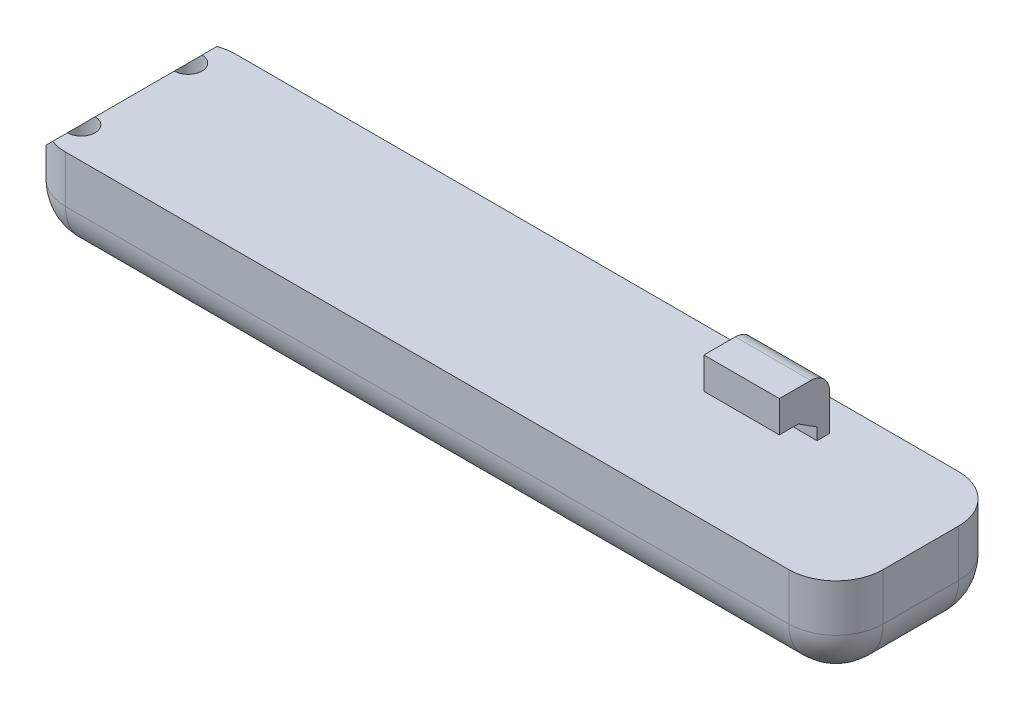
ISO-10303-21;
HEADER;
FILE_DESCRIPTION(('STEP AP214'),'2;1');
FILE_NAME('part.step','',(''),(''),'','','');
FILE_SCHEMA(('AUTOMOTIVE_DESIGN { 1 0 10303 214 1 1 1 1 }'));
ENDSEC;
DATA;
#1=APPLICATION_CONTEXT('core data for automotive mechanical design processes');
#2=APPLICATION_PROTOCOL_DEFINITION('international standard','automotive_design',2000,#1);
#3=PRODUCT_CONTEXT('',#1,'mechanical');
#4=PRODUCT('Part','Part','',(#3));
#5=PRODUCT_RELATED_PRODUCT_CATEGORY('part','',(#4));
#6=PRODUCT_DEFINITION_FORMATION('','',#4);
#7=PRODUCT_DEFINITION_CONTEXT('part definition',#1,'design');
#8=PRODUCT_DEFINITION('design','',#6,#7);
#9=PRODUCT_DEFINITION_SHAPE('','',#8);
#10=(LENGTH_UNIT() NAMED_UNIT(*) SI_UNIT(.MILLI.,.METRE.));
#11=(NAMED_UNIT(*) PLANE_ANGLE_UNIT() SI_UNIT($,.RADIAN.));
#12=(NAMED_UNIT(*) SI_UNIT($,.STERADIAN.) SOLID_ANGLE_UNIT());
#13=UNCERTAINTY_MEASURE_WITH_UNIT(LENGTH_MEASURE(1.E-05),#10,'distance_accuracy_value','');
#14=(GEOMETRIC_REPRESENTATION_CONTEXT(3) GLOBAL_UNCERTAINTY_ASSIGNED_CONTEXT((#13)) GLOBAL_UNIT_ASSIGNED_CONTEXT((#10,
#11,#12)) REPRESENTATION_CONTEXT('',''));
#15=CARTESIAN_POINT('',(0.,0.,0.));
#16=DIRECTION('',(0.,0.,1.));
#17=DIRECTION('',(1.,0.,0.));
#18=AXIS2_PLACEMENT_3D('',#15,#16,#17);
#19=CARTESIAN_POINT('',(0.,20.8,-19.));
#20=DIRECTION('',(1.,0.,0.));
#21=DIRECTION('',(0.,0.,-1.));
#22=AXIS2_PLACEMENT_3D('',#19,#20,#21);
#23=CYLINDRICAL_SURFACE('',#22,3.);
#24=DIRECTION('',(-1.,0.,0.));
#25=VECTOR('',#24,1.);
#26=CARTESIAN_POINT('',(0.,23.8,-19.));
#27=LINE('',#26,#25);
#28=CARTESIAN_POINT('',(107.,23.8,-19.));
#29=VERTEX_POINT('',#28);
#30=CARTESIAN_POINT('',(95.0000000000001,23.8,-19.));
#31=VERTEX_POINT('',#30);
#32=EDGE_CURVE('E386',#29,#31,#27,.T.);
#33=ORIENTED_EDGE('',*,*,#32,.F.);
#34=CARTESIAN_POINT('',(107.,20.8,-19.));
#35=DIRECTION('',(-1.,0.,0.));
#36=DIRECTION('',(0.,0.,1.));
#37=AXIS2_PLACEMENT_3D('',#34,#35,#36);
#38=CIRCLE('',#37,3.);
#39=CARTESIAN_POINT('',(107.,20.8,-22.));
#40=VERTEX_POINT('',#39);
#41=EDGE_CURVE('E55',#40,#29,#38,.F.);
#42=ORIENTED_EDGE('',*,*,#41,.F.);
#43=DIRECTION('',(-1.,0.,0.));
#44=VECTOR('',#43,1.);
#45=CARTESIAN_POINT('',(0.,20.8,-22.));
#46=LINE('',#45,#44);
#47=CARTESIAN_POINT('',(95.0000000000001,20.8,-22.));
#48=VERTEX_POINT('',#47);
#49=EDGE_CURVE('E390',#48,#40,#46,.F.);
#50=ORIENTED_EDGE('',*,*,#49,.F.);
#51=CARTESIAN_POINT('',(95.0000000000001,20.8,-19.));
#52=DIRECTION('',(1.,0.,0.));
#53=DIRECTION('',(0.,0.,-1.));
#54=AXIS2_PLACEMENT_3D('',#51,#52,#53);
#55=CIRCLE('',#54,3.);
#56=EDGE_CURVE('E11',#31,#48,#55,.F.);
#57=ORIENTED_EDGE('',*,*,#56,.F.);
#58=EDGE_LOOP('',(#33,#42,#50,#57));
#59=FACE_BOUND('',#58,.T.);
#60=ADVANCED_FACE('F47',(#59),#23,.T.);
#61=CARTESIAN_POINT('',(122.5,15.,-19.5));
#62=DIRECTION('',(0.,1.,0.));
#63=DIRECTION('',(0.,0.,1.));
#64=AXIS2_PLACEMENT_3D('',#61,#62,#63);
#65=PLANE('',#64);
#66=CARTESIAN_POINT('',(5.00000000000006,15.,-22.));
#67=DIRECTION('',(0.,1.,0.));
#68=DIRECTION('',(0.,0.,1.));
#69=AXIS2_PLACEMENT_3D('',#66,#67,#68);
#70=CIRCLE('',#69,2.2);
#71=CARTESIAN_POINT('',(5.00000000000009,15.,-19.8));
#72=VERTEX_POINT('',#71);
#73=CARTESIAN_POINT('',(5.0000000000001,15.,-24.2));
#74=VERTEX_POINT('',#73);
#75=EDGE_CURVE('E230',#72,#74,#70,.T.);
#76=ORIENTED_EDGE('',*,*,#75,.F.);
#77=DIRECTION('',(0.,0.,1.));
#78=VECTOR('',#77,1.);
#79=CARTESIAN_POINT('',(5.00000000000005,15.,-7.50000000000006));
#80=LINE('',#79,#78);
#81=CARTESIAN_POINT('',(5.00000000000005,15.,-7.2));
#82=VERTEX_POINT('',#81);
#83=EDGE_CURVE('E371',#72,#82,#80,.T.);
#84=ORIENTED_EDGE('',*,*,#83,.T.);
#85=CARTESIAN_POINT('',(5.00000000000006,15.,-5.));
#86=DIRECTION('',(0.,1.,0.));
#87=DIRECTION('',(0.,0.,1.));
#88=AXIS2_PLACEMENT_3D('',#85,#86,#87);
#89=CIRCLE('',#88,2.2);
#90=CARTESIAN_POINT('',(5.00000000000004,15.,-2.8));
#91=VERTEX_POINT('',#90);
#92=EDGE_CURVE('E233',#91,#82,#89,.T.);
#93=ORIENTED_EDGE('',*,*,#92,.F.);
#94=CARTESIAN_POINT('',(5.00000000000003,15.,-0.428932188134521));
#95=VERTEX_POINT('',#94);
#96=EDGE_CURVE('E365',#91,#95,#80,.T.);
#97=ORIENTED_EDGE('',*,*,#96,.T.);
#98=CARTESIAN_POINT('',(7.50000000000002,15.,-7.5));
#99=DIRECTION('',(0.,1.,0.));
#100=DIRECTION('',(0.,0.,-1.));
#101=AXIS2_PLACEMENT_3D('',#98,#99,#100);
#102=CIRCLE('',#101,7.5);
#103=CARTESIAN_POINT('',(7.50000000000007,15.,0.));
#104=VERTEX_POINT('',#103);
#105=EDGE_CURVE('E249',#95,#104,#102,.T.);
#106=ORIENTED_EDGE('',*,*,#105,.T.);
#107=DIRECTION('',(1.,0.,0.));
#108=VECTOR('',#107,1.);
#109=CARTESIAN_POINT('',(7.50000000000007,15.,0.));
#110=LINE('',#109,#108);
#111=CARTESIAN_POINT('',(122.5,15.,0.));
#112=VERTEX_POINT('',#111);
#113=EDGE_CURVE('E252',#104,#112,#110,.T.);
#114=ORIENTED_EDGE('',*,*,#113,.T.);
#115=CARTESIAN_POINT('',(122.5,15.,-7.5));
#116=DIRECTION('',(0.,1.,0.));
#117=DIRECTION('',(0.,0.,-1.));
#118=AXIS2_PLACEMENT_3D('',#115,#116,#117);
#119=CIRCLE('',#118,7.5);
#120=CARTESIAN_POINT('',(130.,15.,-7.5));
#121=VERTEX_POINT('',#120);
#122=EDGE_CURVE('E255',#112,#121,#119,.T.);
#123=ORIENTED_EDGE('',*,*,#122,.T.);
#124=DIRECTION('',(0.,0.,-1.));
#125=VECTOR('',#124,1.);
#126=CARTESIAN_POINT('',(130.,15.,-19.4999999999999));
#127=LINE('',#126,#125);
#128=CARTESIAN_POINT('',(130.,15.,-19.4999999999999));
#129=VERTEX_POINT('',#128);
#130=EDGE_CURVE('E258',#121,#129,#127,.T.);
#131=ORIENTED_EDGE('',*,*,#130,.T.);
#132=CARTESIAN_POINT('',(122.5,15.,-19.5));
#133=DIRECTION('',(0.,1.,0.));
#134=DIRECTION('',(0.,0.,1.));
#135=AXIS2_PLACEMENT_3D('',#132,#133,#134);
#136=CIRCLE('',#135,7.5);
#137=CARTESIAN_POINT('',(122.5,15.,-27.));
#138=VERTEX_POINT('',#137);
#139=EDGE_CURVE('E229',#129,#138,#136,.T.);
#140=ORIENTED_EDGE('',*,*,#139,.T.);
#141=DIRECTION('',(-1.,0.,0.));
#142=VECTOR('',#141,1.);
#143=CARTESIAN_POINT('',(7.50000000000011,15.,-27.));
#144=LINE('',#143,#142);
#145=CARTESIAN_POINT('',(7.50000000000006,15.,-27.));
#146=VERTEX_POINT('',#145);
#147=EDGE_CURVE('E242',#138,#146,#144,.T.);
#148=ORIENTED_EDGE('',*,*,#147,.T.);
#149=CARTESIAN_POINT('',(7.50000000000006,15.,-19.5));
#150=DIRECTION('',(0.,1.,0.));
#151=DIRECTION('',(0.,0.,-1.));
#152=AXIS2_PLACEMENT_3D('',#149,#150,#151);
#153=CIRCLE('',#152,7.5);
#154=CARTESIAN_POINT('',(5.00000000000011,15.,-26.5710678118655));
#155=VERTEX_POINT('',#154);
#156=EDGE_CURVE('E245',#146,#155,#153,.T.);
#157=ORIENTED_EDGE('',*,*,#156,.T.);
#158=EDGE_CURVE('E366',#155,#74,#80,.T.);
#159=ORIENTED_EDGE('',*,*,#158,.T.);
#160=EDGE_LOOP('',(#76,#84,#93,#97,#106,#114,#123,#131,#140,#148,#157,#159));
#161=FACE_BOUND('',#160,.T.);
#162=DIRECTION('',(1.,0.,0.));
#163=VECTOR('',#162,1.);
#164=CARTESIAN_POINT('',(95.0000000000001,15.,-20.));
#165=LINE('',#164,#163);
#166=CARTESIAN_POINT('',(95.0000000000001,15.,-20.));
#167=VERTEX_POINT('',#166);
#168=CARTESIAN_POINT('',(107.,15.,-20.));
#169=VERTEX_POINT('',#168);
#170=EDGE_CURVE('E211',#167,#169,#165,.T.);
#171=ORIENTED_EDGE('',*,*,#170,.F.);
#172=DIRECTION('',(0.,0.,1.));
#173=VECTOR('',#172,1.);
#174=CARTESIAN_POINT('',(95.0000000000001,15.,-22.));
#175=LINE('',#174,#173);
#176=CARTESIAN_POINT('',(95.0000000000001,15.,-22.));
#177=VERTEX_POINT('',#176);
#178=EDGE_CURVE('E425',#177,#167,#175,.T.);
#179=ORIENTED_EDGE('',*,*,#178,.F.);
#180=DIRECTION('',(-1.,0.,0.));
#181=VECTOR('',#180,1.);
#182=CARTESIAN_POINT('',(95.0000000000001,15.,-22.));
#183=LINE('',#182,#181);
#184=CARTESIAN_POINT('',(107.,15.,-22.));
#185=VERTEX_POINT('',#184);
#186=EDGE_CURVE('E434',#185,#177,#183,.T.);
#187=ORIENTED_EDGE('',*,*,#186,.F.);
#188=DIRECTION('',(0.,0.,-1.));
#189=VECTOR('',#188,1.);
#190=CARTESIAN_POINT('',(107.,15.,-22.));
#191=LINE('',#190,#189);
#192=EDGE_CURVE('E431',#169,#185,#191,.T.);
#193=ORIENTED_EDGE('',*,*,#192,.F.);
#194=EDGE_LOOP('',(#171,#179,#187,#193));
#195=FACE_BOUND('',#194,.T.);
#196=ADVANCED_FACE('F445',(#161,#195),#65,.T.);
#197=CARTESIAN_POINT('',(122.5,7.5,-7.5));
#198=DIRECTION('',(-1.,0.,0.));
#199=DIRECTION('',(0.,0.,1.));
#200=AXIS2_PLACEMENT_3D('',#197,#198,#199);
#201=CYLINDRICAL_SURFACE('',#200,7.5);
#202=CARTESIAN_POINT('',(7.50000000000007,7.5,-7.5));
#203=DIRECTION('',(-1.,0.,0.));
#204=DIRECTION('',(0.,0.,1.));
#205=AXIS2_PLACEMENT_3D('',#202,#203,#204);
#206=CIRCLE('',#205,7.5);
#207=CARTESIAN_POINT('',(7.50000000000007,0.,-7.5));
#208=VERTEX_POINT('',#207);
#209=CARTESIAN_POINT('',(7.50000000000007,7.5,0.));
#210=VERTEX_POINT('',#209);
#211=EDGE_CURVE('E362',#208,#210,#206,.T.);
#212=ORIENTED_EDGE('',*,*,#211,.F.);
#213=DIRECTION('',(-1.,0.,0.));
#214=VECTOR('',#213,1.);
#215=CARTESIAN_POINT('',(122.5,0.,-7.5));
#216=LINE('',#215,#214);
#217=CARTESIAN_POINT('',(122.5,0.,-7.5));
#218=VERTEX_POINT('',#217);
#219=EDGE_CURVE('E295',#218,#208,#216,.T.);
#220=ORIENTED_EDGE('',*,*,#219,.F.);
#221=CARTESIAN_POINT('',(122.5,7.5,-7.5));
#222=DIRECTION('',(-1.,0.,0.));
#223=DIRECTION('',(0.,0.,1.));
#224=AXIS2_PLACEMENT_3D('',#221,#222,#223);
#225=CIRCLE('',#224,7.5);
#226=CARTESIAN_POINT('',(122.5,7.5,0.));
#227=VERTEX_POINT('',#226);
#228=EDGE_CURVE('E359',#218,#227,#225,.T.);
#229=ORIENTED_EDGE('',*,*,#228,.T.);
#230=DIRECTION('',(-1.,0.,0.));
#231=VECTOR('',#230,1.);
#232=CARTESIAN_POINT('',(7.50000000000007,7.5,0.));
#233=LINE('',#232,#231);
#234=EDGE_CURVE('E335',#210,#227,#233,.F.);
#235=ORIENTED_EDGE('',*,*,#234,.F.);
#236=EDGE_LOOP('',(#212,#220,#229,#235));
#237=FACE_BOUND('',#236,.T.);
#238=ADVANCED_FACE('F447',(#237),#201,.T.);
#239=CARTESIAN_POINT('',(122.5,7.5,-7.5));
#240=DIRECTION('',(0.,1.,0.));
#241=DIRECTION('',(0.,0.,1.));
#242=AXIS2_PLACEMENT_3D('',#239,#240,#241);
#243=SPHERICAL_SURFACE('',#242,7.5);
#244=ORIENTED_EDGE('',*,*,#228,.F.);
#245=CARTESIAN_POINT('',(122.5,7.5,-7.50000000000005));
#246=DIRECTION('',(0.,0.,1.));
#247=DIRECTION('',(1.,0.,0.));
#248=AXIS2_PLACEMENT_3D('',#245,#246,#247);
#249=CIRCLE('',#248,7.5);
#250=CARTESIAN_POINT('',(130.,7.5,-7.5));
#251=VERTEX_POINT('',#250);
#252=EDGE_CURVE('E356',#218,#251,#249,.T.);
#253=ORIENTED_EDGE('',*,*,#252,.T.);
#254=CARTESIAN_POINT('',(122.5,7.5,-7.5));
#255=DIRECTION('',(0.,-1.,0.));
#256=DIRECTION('',(0.,0.,-1.));
#257=AXIS2_PLACEMENT_3D('',#254,#255,#256);
#258=CIRCLE('',#257,7.5);
#259=EDGE_CURVE('E331',#227,#251,#258,.F.);
#260=ORIENTED_EDGE('',*,*,#259,.F.);
#261=EDGE_LOOP('',(#244,#253,#260));
#262=FACE_BOUND('',#261,.T.);
#263=ADVANCED_FACE('F455',(#262),#243,.T.);
#264=CARTESIAN_POINT('',(122.5,7.5,-19.5));
#265=DIRECTION('',(0.,0.,1.));
#266=DIRECTION('',(1.,0.,0.));
#267=AXIS2_PLACEMENT_3D('',#264,#265,#266);
#268=CYLINDRICAL_SURFACE('',#267,7.5);
#269=ORIENTED_EDGE('',*,*,#252,.F.);
#270=DIRECTION('',(0.,0.,1.));
#271=VECTOR('',#270,1.);
#272=CARTESIAN_POINT('',(122.5,0.,-19.5));
#273=LINE('',#272,#271);
#274=CARTESIAN_POINT('',(122.5,0.,-19.5));
#275=VERTEX_POINT('',#274);
#276=EDGE_CURVE('E299',#275,#218,#273,.T.);
#277=ORIENTED_EDGE('',*,*,#276,.F.);
#278=CARTESIAN_POINT('',(122.5,7.5,-19.5));
#279=DIRECTION('',(0.,0.,1.));
#280=DIRECTION('',(1.,0.,0.));
#281=AXIS2_PLACEMENT_3D('',#278,#279,#280);
#282=CIRCLE('',#281,7.5);
#283=CARTESIAN_POINT('',(130.,7.5,-19.4999999999999));
#284=VERTEX_POINT('',#283);
#285=EDGE_CURVE('E353',#275,#284,#282,.T.);
#286=ORIENTED_EDGE('',*,*,#285,.T.);
#287=DIRECTION('',(0.,0.,1.));
#288=VECTOR('',#287,1.);
#289=CARTESIAN_POINT('',(130.,7.5,-19.4999999999999));
#290=LINE('',#289,#288);
#291=EDGE_CURVE('E327',#251,#284,#290,.F.);
#292=ORIENTED_EDGE('',*,*,#291,.F.);
#293=EDGE_LOOP('',(#269,#277,#286,#292));
#294=FACE_BOUND('',#293,.T.);
#295=ADVANCED_FACE('F520',(#294),#268,.T.);
#296=CARTESIAN_POINT('',(122.5,7.5,-19.5));
#297=DIRECTION('',(0.,1.,0.));
#298=DIRECTION('',(0.,0.,1.));
#299=AXIS2_PLACEMENT_3D('',#296,#297,#298);
#300=SPHERICAL_SURFACE('',#299,7.5);
#301=ORIENTED_EDGE('',*,*,#285,.F.);
#302=CARTESIAN_POINT('',(122.5,7.5,-19.5));
#303=DIRECTION('',(1.,0.,0.));
#304=DIRECTION('',(0.,0.,-1.));
#305=AXIS2_PLACEMENT_3D('',#302,#303,#304);
#306=CIRCLE('',#305,7.5);
#307=CARTESIAN_POINT('',(122.5,7.5,-27.));
#308=VERTEX_POINT('',#307);
#309=EDGE_CURVE('E350',#275,#308,#306,.T.);
#310=ORIENTED_EDGE('',*,*,#309,.T.);
#311=CARTESIAN_POINT('',(122.5,7.5,-19.5));
#312=DIRECTION('',(0.,-1.,0.));
#313=DIRECTION('',(0.,0.,-1.));
#314=AXIS2_PLACEMENT_3D('',#311,#312,#313);
#315=CIRCLE('',#314,7.5);
#316=EDGE_CURVE('E323',#284,#308,#315,.F.);
#317=ORIENTED_EDGE('',*,*,#316,.F.);
#318=EDGE_LOOP('',(#301,#310,#317));
#319=FACE_BOUND('',#318,.T.);
#320=ADVANCED_FACE('F516',(#319),#300,.T.);
#321=CARTESIAN_POINT('',(122.5,7.5,-19.5));
#322=DIRECTION('',(1.,0.,0.));
#323=DIRECTION('',(0.,0.,-1.));
#324=AXIS2_PLACEMENT_3D('',#321,#322,#323);
#325=CYLINDRICAL_SURFACE('',#324,7.5);
#326=ORIENTED_EDGE('',*,*,#309,.F.);
#327=DIRECTION('',(1.,0.,0.));
#328=VECTOR('',#327,1.);
#329=CARTESIAN_POINT('',(122.5,0.,-19.5));
#330=LINE('',#329,#328);
#331=CARTESIAN_POINT('',(7.50000000000006,0.,-19.5));
#332=VERTEX_POINT('',#331);
#333=EDGE_CURVE('E303',#332,#275,#330,.T.);
#334=ORIENTED_EDGE('',*,*,#333,.F.);
#335=CARTESIAN_POINT('',(7.50000000000006,7.5,-19.5));
#336=DIRECTION('',(1.,0.,0.));
#337=DIRECTION('',(0.,0.,-1.));
#338=AXIS2_PLACEMENT_3D('',#335,#336,#337);
#339=CIRCLE('',#338,7.5);
#340=CARTESIAN_POINT('',(7.50000000000006,7.5,-27.));
#341=VERTEX_POINT('',#340);
#342=EDGE_CURVE('E347',#332,#341,#339,.T.);
#343=ORIENTED_EDGE('',*,*,#342,.T.);
#344=DIRECTION('',(1.,0.,0.));
#345=VECTOR('',#344,1.);
#346=CARTESIAN_POINT('',(7.50000000000011,7.5,-27.));
#347=LINE('',#346,#345);
#348=EDGE_CURVE('E319',#308,#341,#347,.F.);
#349=ORIENTED_EDGE('',*,*,#348,.F.);
#350=EDGE_LOOP('',(#326,#334,#343,#349));
#351=FACE_BOUND('',#350,.T.);
#352=ADVANCED_FACE('F512',(#351),#325,.T.);
#353=CARTESIAN_POINT('',(7.50000000000006,7.5,-19.5));
#354=DIRECTION('',(0.,1.,0.));
#355=DIRECTION('',(0.,0.,1.));
#356=AXIS2_PLACEMENT_3D('',#353,#354,#355);
#357=SPHERICAL_SURFACE('',#356,7.5);
#358=ORIENTED_EDGE('',*,*,#342,.F.);
#359=CARTESIAN_POINT('',(7.50000000000006,7.5,-19.5));
#360=DIRECTION('',(0.,0.,-1.));
#361=DIRECTION('',(-1.,0.,0.));
#362=AXIS2_PLACEMENT_3D('',#359,#360,#361);
#363=CIRCLE('',#362,7.5);
#364=CARTESIAN_POINT('',(0.,7.5,-19.5));
#365=VERTEX_POINT('',#364);
#366=EDGE_CURVE('E343',#332,#365,#363,.T.);
#367=ORIENTED_EDGE('',*,*,#366,.T.);
#368=CARTESIAN_POINT('',(7.50000000000006,7.5,-19.5));
#369=DIRECTION('',(0.,-1.,0.));
#370=DIRECTION('',(0.,0.,-1.));
#371=AXIS2_PLACEMENT_3D('',#368,#369,#370);
#372=CIRCLE('',#371,7.5);
#373=EDGE_CURVE('E315',#341,#365,#372,.F.);
#374=ORIENTED_EDGE('',*,*,#373,.F.);
#375=EDGE_LOOP('',(#358,#367,#374));
#376=FACE_BOUND('',#375,.T.);
#377=ADVANCED_FACE('F508',(#376),#357,.T.);
#378=CARTESIAN_POINT('',(7.50000000000006,7.5,-19.5000000000004));
#379=DIRECTION('',(0.,0.,-1.));
#380=DIRECTION('',(-1.,0.,0.));
#381=AXIS2_PLACEMENT_3D('',#378,#379,#380);
#382=CYLINDRICAL_SURFACE('',#381,7.5);
#383=ORIENTED_EDGE('',*,*,#366,.F.);
#384=DIRECTION('',(0.,0.,-1.));
#385=VECTOR('',#384,1.);
#386=CARTESIAN_POINT('',(7.50000000000006,0.,-19.5000000000004));
#387=LINE('',#386,#385);
#388=EDGE_CURVE('E307',#208,#332,#387,.T.);
#389=ORIENTED_EDGE('',*,*,#388,.F.);
#390=CARTESIAN_POINT('',(7.50000000000002,7.5,-7.5));
#391=DIRECTION('',(0.,0.,-1.));
#392=DIRECTION('',(-1.,0.,0.));
#393=AXIS2_PLACEMENT_3D('',#390,#391,#392);
#394=CIRCLE('',#393,7.5);
#395=CARTESIAN_POINT('',(0.,7.5,-7.50000000000007));
#396=VERTEX_POINT('',#395);
#397=EDGE_CURVE('E339',#208,#396,#394,.T.);
#398=ORIENTED_EDGE('',*,*,#397,.T.);
#399=DIRECTION('',(0.,0.,-1.));
#400=VECTOR('',#399,1.);
#401=CARTESIAN_POINT('',(0.,7.5,-19.5));
#402=LINE('',#401,#400);
#403=EDGE_CURVE('E311',#365,#396,#402,.F.);
#404=ORIENTED_EDGE('',*,*,#403,.F.);
#405=EDGE_LOOP('',(#383,#389,#398,#404));
#406=FACE_BOUND('',#405,.T.);
#407=ADVANCED_FACE('F504',(#406),#382,.T.);
#408=CARTESIAN_POINT('',(7.50000000000002,7.5,-7.5));
#409=DIRECTION('',(0.,1.,0.));
#410=DIRECTION('',(0.,0.,1.));
#411=AXIS2_PLACEMENT_3D('',#408,#409,#410);
#412=SPHERICAL_SURFACE('',#411,7.5);
#413=ORIENTED_EDGE('',*,*,#397,.F.);
#414=ORIENTED_EDGE('',*,*,#211,.T.);
#415=CARTESIAN_POINT('',(7.50000000000002,7.5,-7.5));
#416=DIRECTION('',(0.,-1.,0.));
#417=DIRECTION('',(0.,0.,-1.));
#418=AXIS2_PLACEMENT_3D('',#415,#416,#417);
#419=CIRCLE('',#418,7.5);
#420=EDGE_CURVE('E291',#396,#210,#419,.F.);
#421=ORIENTED_EDGE('',*,*,#420,.F.);
#422=EDGE_LOOP('',(#413,#414,#421));
#423=FACE_BOUND('',#422,.T.);
#424=ADVANCED_FACE('F500',(#423),#412,.T.);
#425=CARTESIAN_POINT('',(122.5,15.,-19.5));
#426=DIRECTION('',(0.,-1.,0.));
#427=DIRECTION('',(0.,0.,-1.));
#428=AXIS2_PLACEMENT_3D('',#425,#426,#427);
#429=CYLINDRICAL_SURFACE('',#428,7.5);
#430=DIRECTION('',(0.,-1.,0.));
#431=VECTOR('',#430,1.);
#432=CARTESIAN_POINT('',(130.,15.,-19.4999999999999));
#433=LINE('',#432,#431);
#434=EDGE_CURVE('E261',#129,#284,#433,.T.);
#435=ORIENTED_EDGE('',*,*,#434,.T.);
#436=ORIENTED_EDGE('',*,*,#316,.T.);
#437=DIRECTION('',(0.,-1.,0.));
#438=VECTOR('',#437,1.);
#439=CARTESIAN_POINT('',(122.5,15.,-27.));
#440=LINE('',#439,#438);
#441=EDGE_CURVE('E287',#138,#308,#440,.T.);
#442=ORIENTED_EDGE('',*,*,#441,.F.);
#443=ORIENTED_EDGE('',*,*,#139,.F.);
#444=EDGE_LOOP('',(#435,#436,#442,#443));
#445=FACE_BOUND('',#444,.T.);
#446=ADVANCED_FACE('F496',(#445),#429,.T.);
#447=CARTESIAN_POINT('',(7.50000000000011,15.,-27.));
#448=DIRECTION('',(0.,0.,1.));
#449=DIRECTION('',(1.,0.,0.));
#450=AXIS2_PLACEMENT_3D('',#447,#448,#449);
#451=PLANE('',#450);
#452=ORIENTED_EDGE('',*,*,#441,.T.);
#453=ORIENTED_EDGE('',*,*,#348,.T.);
#454=DIRECTION('',(0.,-1.,0.));
#455=VECTOR('',#454,1.);
#456=CARTESIAN_POINT('',(7.50000000000006,15.,-27.));
#457=LINE('',#456,#455);
#458=EDGE_CURVE('E283',#146,#341,#457,.T.);
#459=ORIENTED_EDGE('',*,*,#458,.F.);
#460=ORIENTED_EDGE('',*,*,#147,.F.);
#461=EDGE_LOOP('',(#452,#453,#459,#460));
#462=FACE_BOUND('',#461,.T.);
#463=ADVANCED_FACE('F492',(#462),#451,.F.);
#464=CARTESIAN_POINT('',(7.50000000000006,15.,-19.5));
#465=DIRECTION('',(0.,-1.,0.));
#466=DIRECTION('',(0.,0.,-1.));
#467=AXIS2_PLACEMENT_3D('',#464,#465,#466);
#468=CYLINDRICAL_SURFACE('',#467,7.5);
#469=DIRECTION('',(0.,-1.,0.));
#470=VECTOR('',#469,1.);
#471=CARTESIAN_POINT('',(0.,15.,-19.5));
#472=LINE('',#471,#470);
#473=CARTESIAN_POINT('',(0.,9.99999999999998,-19.5));
#474=VERTEX_POINT('',#473);
#475=EDGE_CURVE('E280',#474,#365,#472,.T.);
#476=ORIENTED_EDGE('',*,*,#475,.F.);
#477=CARTESIAN_POINT('',(7.50000000000006,17.5,-19.5));
#478=DIRECTION('',(-0.707106781186547,0.707106781186548,0.));
#479=DIRECTION('',(-0.707106781186548,-0.707106781186547,0.));
#480=AXIS2_PLACEMENT_3D('',#477,#478,#479);
#481=ELLIPSE('',#480,10.6066017177982,7.5);
#482=EDGE_CURVE('E377',#474,#155,#481,.F.);
#483=ORIENTED_EDGE('',*,*,#482,.T.);
#484=ORIENTED_EDGE('',*,*,#156,.F.);
#485=ORIENTED_EDGE('',*,*,#458,.T.);
#486=ORIENTED_EDGE('',*,*,#373,.T.);
#487=EDGE_LOOP('',(#476,#483,#484,#485,#486));
#488=FACE_BOUND('',#487,.T.);
#489=ADVANCED_FACE('F488',(#488),#468,.T.);
#490=CARTESIAN_POINT('',(0.,15.,-19.5));
#491=DIRECTION('',(1.,0.,0.));
#492=DIRECTION('',(0.,0.,-1.));
#493=AXIS2_PLACEMENT_3D('',#490,#491,#492);
#494=PLANE('',#493);
#495=DIRECTION('',(0.,-1.,0.));
#496=VECTOR('',#495,1.);
#497=CARTESIAN_POINT('',(0.,15.,-7.50000000000007));
#498=LINE('',#497,#496);
#499=CARTESIAN_POINT('',(0.,9.99999999999998,-7.50000000000007));
#500=VERTEX_POINT('',#499);
#501=EDGE_CURVE('E277',#500,#396,#498,.T.);
#502=ORIENTED_EDGE('',*,*,#501,.F.);
#503=DIRECTION('',(0.,0.,-1.));
#504=VECTOR('',#503,1.);
#505=CARTESIAN_POINT('',(0.,9.99999999999998,-19.5));
#506=LINE('',#505,#504);
#507=EDGE_CURVE('E374',#500,#474,#506,.T.);
#508=ORIENTED_EDGE('',*,*,#507,.T.);
#509=ORIENTED_EDGE('',*,*,#475,.T.);
#510=ORIENTED_EDGE('',*,*,#403,.T.);
#511=EDGE_LOOP('',(#502,#508,#509,#510));
#512=FACE_BOUND('',#511,.T.);
#513=ADVANCED_FACE('F484',(#512),#494,.F.);
#514=CARTESIAN_POINT('',(7.50000000000002,15.,-7.5));
#515=DIRECTION('',(0.,-1.,0.));
#516=DIRECTION('',(0.,0.,-1.));
#517=AXIS2_PLACEMENT_3D('',#514,#515,#516);
#518=CYLINDRICAL_SURFACE('',#517,7.5);
#519=ORIENTED_EDGE('',*,*,#105,.F.);
#520=CARTESIAN_POINT('',(7.50000000000002,17.5,-7.5));
#521=DIRECTION('',(-0.707106781186547,0.707106781186548,0.));
#522=DIRECTION('',(-0.707106781186548,-0.707106781186547,0.));
#523=AXIS2_PLACEMENT_3D('',#520,#521,#522);
#524=ELLIPSE('',#523,10.6066017177982,7.5);
#525=EDGE_CURVE('E370',#95,#500,#524,.F.);
#526=ORIENTED_EDGE('',*,*,#525,.T.);
#527=ORIENTED_EDGE('',*,*,#501,.T.);
#528=ORIENTED_EDGE('',*,*,#420,.T.);
#529=DIRECTION('',(0.,-1.,0.));
#530=VECTOR('',#529,1.);
#531=CARTESIAN_POINT('',(7.50000000000007,15.,0.));
#532=LINE('',#531,#530);
#533=EDGE_CURVE('E273',#104,#210,#532,.T.);
#534=ORIENTED_EDGE('',*,*,#533,.F.);
#535=EDGE_LOOP('',(#519,#526,#527,#528,#534));
#536=FACE_BOUND('',#535,.T.);
#537=ADVANCED_FACE('F480',(#536),#518,.T.);
#538=CARTESIAN_POINT('',(7.50000000000007,15.,0.));
#539=DIRECTION('',(0.,0.,-1.));
#540=DIRECTION('',(-1.,0.,0.));
#541=AXIS2_PLACEMENT_3D('',#538,#539,#540);
#542=PLANE('',#541);
#543=ORIENTED_EDGE('',*,*,#533,.T.);
#544=ORIENTED_EDGE('',*,*,#234,.T.);
#545=DIRECTION('',(0.,-1.,0.));
#546=VECTOR('',#545,1.);
#547=CARTESIAN_POINT('',(122.5,15.,0.));
#548=LINE('',#547,#546);
#549=EDGE_CURVE('E269',#112,#227,#548,.T.);
#550=ORIENTED_EDGE('',*,*,#549,.F.);
#551=ORIENTED_EDGE('',*,*,#113,.F.);
#552=EDGE_LOOP('',(#543,#544,#550,#551));
#553=FACE_BOUND('',#552,.T.);
#554=ADVANCED_FACE('F476',(#553),#542,.F.);
#555=CARTESIAN_POINT('',(122.5,15.,-7.5));
#556=DIRECTION('',(0.,-1.,0.));
#557=DIRECTION('',(0.,0.,-1.));
#558=AXIS2_PLACEMENT_3D('',#555,#556,#557);
#559=CYLINDRICAL_SURFACE('',#558,7.5);
#560=ORIENTED_EDGE('',*,*,#549,.T.);
#561=ORIENTED_EDGE('',*,*,#259,.T.);
#562=DIRECTION('',(0.,-1.,0.));
#563=VECTOR('',#562,1.);
#564=CARTESIAN_POINT('',(130.,15.,-7.5));
#565=LINE('',#564,#563);
#566=EDGE_CURVE('E265',#121,#251,#565,.T.);
#567=ORIENTED_EDGE('',*,*,#566,.F.);
#568=ORIENTED_EDGE('',*,*,#122,.F.);
#569=EDGE_LOOP('',(#560,#561,#567,#568));
#570=FACE_BOUND('',#569,.T.);
#571=ADVANCED_FACE('F472',(#570),#559,.T.);
#572=CARTESIAN_POINT('',(130.,15.,-19.4999999999999));
#573=DIRECTION('',(-1.,0.,0.));
#574=DIRECTION('',(0.,0.,1.));
#575=AXIS2_PLACEMENT_3D('',#572,#573,#574);
#576=PLANE('',#575);
#577=ORIENTED_EDGE('',*,*,#566,.T.);
#578=ORIENTED_EDGE('',*,*,#291,.T.);
#579=ORIENTED_EDGE('',*,*,#434,.F.);
#580=ORIENTED_EDGE('',*,*,#130,.F.);
#581=EDGE_LOOP('',(#577,#578,#579,#580));
#582=FACE_BOUND('',#581,.T.);
#583=ADVANCED_FACE('F468',(#582),#576,.F.);
#584=CARTESIAN_POINT('',(122.5,0.,-19.5));
#585=DIRECTION('',(0.,1.,0.));
#586=DIRECTION('',(0.,0.,1.));
#587=AXIS2_PLACEMENT_3D('',#584,#585,#586);
#588=PLANE('',#587);
#589=ORIENTED_EDGE('',*,*,#219,.T.);
#590=ORIENTED_EDGE('',*,*,#388,.T.);
#591=ORIENTED_EDGE('',*,*,#333,.T.);
#592=ORIENTED_EDGE('',*,*,#276,.T.);
#593=EDGE_LOOP('',(#589,#590,#591,#592));
#594=FACE_BOUND('',#593,.T.);
#595=ADVANCED_FACE('F464',(#594),#588,.F.);
#596=CARTESIAN_POINT('',(5.00000000000009,15.,-19.5000000000004));
#597=DIRECTION('',(-0.707106781186547,0.707106781186548,0.));
#598=DIRECTION('',(0.,0.,-1.));
#599=AXIS2_PLACEMENT_3D('',#596,#597,#598);
#600=PLANE('',#599);
#601=CARTESIAN_POINT('',(5.00000000000006,15.,-22.));
#602=DIRECTION('',(-0.707106781186547,0.707106781186548,0.));
#603=DIRECTION('',(0.707106781186548,0.707106781186547,0.));
#604=AXIS2_PLACEMENT_3D('',#601,#602,#603);
#605=ELLIPSE('',#604,3.11126983722081,2.2);
#606=EDGE_CURVE('E383',#74,#72,#605,.T.);
#607=ORIENTED_EDGE('',*,*,#606,.F.);
#608=ORIENTED_EDGE('',*,*,#158,.F.);
#609=ORIENTED_EDGE('',*,*,#482,.F.);
#610=ORIENTED_EDGE('',*,*,#507,.F.);
#611=ORIENTED_EDGE('',*,*,#525,.F.);
#612=ORIENTED_EDGE('',*,*,#96,.F.);
#613=CARTESIAN_POINT('',(5.00000000000006,15.,-5.));
#614=DIRECTION('',(-0.707106781186547,0.707106781186548,0.));
#615=DIRECTION('',(0.707106781186548,0.707106781186547,0.));
#616=AXIS2_PLACEMENT_3D('',#613,#614,#615);
#617=ELLIPSE('',#616,3.11126983722081,2.2);
#618=EDGE_CURVE('E380',#82,#91,#617,.T.);
#619=ORIENTED_EDGE('',*,*,#618,.F.);
#620=ORIENTED_EDGE('',*,*,#83,.F.);
#621=EDGE_LOOP('',(#607,#608,#609,#610,#611,#612,#619,#620));
#622=FACE_BOUND('',#621,.T.);
#623=ADVANCED_FACE('F467',(#622),#600,.T.);
#624=CARTESIAN_POINT('',(5.00000000000006,5.,-5.));
#625=DIRECTION('',(0.,1.,0.));
#626=DIRECTION('',(0.,0.,1.));
#627=AXIS2_PLACEMENT_3D('',#624,#625,#626);
#628=CYLINDRICAL_SURFACE('',#627,2.2);
#629=ORIENTED_EDGE('',*,*,#618,.T.);
#630=ORIENTED_EDGE('',*,*,#92,.T.);
#631=EDGE_LOOP('',(#629,#630));
#632=FACE_BOUND('',#631,.T.);
#633=CARTESIAN_POINT('',(5.00000000000006,5.,-5.));
#634=DIRECTION('',(0.,1.,0.));
#635=DIRECTION('',(0.,0.,1.));
#636=AXIS2_PLACEMENT_3D('',#633,#634,#635);
#637=CIRCLE('',#636,2.2);
#638=CARTESIAN_POINT('',(5.00000000000006,5.,-2.8));
#639=VERTEX_POINT('',#638);
#640=EDGE_CURVE('E219',#639,#639,#637,.T.);
#641=ORIENTED_EDGE('',*,*,#640,.F.);
#642=EDGE_LOOP('',(#641));
#643=FACE_BOUND('',#642,.T.);
#644=ADVANCED_FACE('F531',(#632,#643),#628,.F.);
#645=CARTESIAN_POINT('',(5.00000000000006,5.,-5.));
#646=DIRECTION('',(0.,1.,0.));
#647=DIRECTION('',(0.,0.,1.));
#648=AXIS2_PLACEMENT_3D('',#645,#646,#647);
#649=PLANE('',#648);
#650=ORIENTED_EDGE('',*,*,#640,.T.);
#651=EDGE_LOOP('',(#650));
#652=FACE_BOUND('',#651,.T.);
#653=ADVANCED_FACE('F462',(#652),#649,.T.);
#654=CARTESIAN_POINT('',(5.00000000000006,5.,-22.));
#655=DIRECTION('',(0.,1.,0.));
#656=DIRECTION('',(0.,0.,1.));
#657=AXIS2_PLACEMENT_3D('',#654,#655,#656);
#658=CYLINDRICAL_SURFACE('',#657,2.2);
#659=ORIENTED_EDGE('',*,*,#606,.T.);
#660=ORIENTED_EDGE('',*,*,#75,.T.);
#661=EDGE_LOOP('',(#659,#660));
#662=FACE_BOUND('',#661,.T.);
#663=CARTESIAN_POINT('',(5.00000000000006,5.,-22.));
#664=DIRECTION('',(0.,1.,0.));
#665=DIRECTION('',(0.,0.,1.));
#666=AXIS2_PLACEMENT_3D('',#663,#664,#665);
#667=CIRCLE('',#666,2.2);
#668=CARTESIAN_POINT('',(5.00000000000006,5.,-19.8));
#669=VERTEX_POINT('',#668);
#670=EDGE_CURVE('E225',#669,#669,#667,.T.);
#671=ORIENTED_EDGE('',*,*,#670,.F.);
#672=EDGE_LOOP('',(#671));
#673=FACE_BOUND('',#672,.T.);
#674=ADVANCED_FACE('F576',(#662,#673),#658,.F.);
#675=CARTESIAN_POINT('',(5.00000000000006,5.,-22.));
#676=DIRECTION('',(0.,1.,0.));
#677=DIRECTION('',(0.,0.,1.));
#678=AXIS2_PLACEMENT_3D('',#675,#676,#677);
#679=PLANE('',#678);
#680=ORIENTED_EDGE('',*,*,#670,.T.);
#681=EDGE_LOOP('',(#680));
#682=FACE_BOUND('',#681,.T.);
#683=ADVANCED_FACE('F580',(#682),#679,.T.);
#684=CARTESIAN_POINT('',(95.0000000000001,18.8,-22.));
#685=DIRECTION('',(1.,0.,0.));
#686=DIRECTION('',(0.,0.,-1.));
#687=AXIS2_PLACEMENT_3D('',#684,#685,#686);
#688=PLANE('',#687);
#689=DIRECTION('',(0.,-1.,0.));
#690=VECTOR('',#689,1.);
#691=CARTESIAN_POINT('',(95.0000000000001,18.8,-20.));
#692=LINE('',#691,#690);
#693=CARTESIAN_POINT('',(95.0000000000001,16.9,-20.));
#694=VERTEX_POINT('',#693);
#695=EDGE_CURVE('E214',#694,#167,#692,.T.);
#696=ORIENTED_EDGE('',*,*,#695,.F.);
#697=DIRECTION('',(0.,0.535052081184345,0.844819075554228));
#698=VECTOR('',#697,1.);
#699=CARTESIAN_POINT('',(95.0000000000001,16.9,-20.));
#700=LINE('',#699,#698);
#701=CARTESIAN_POINT('',(95.0000000000001,18.8,-17.));
#702=VERTEX_POINT('',#701);
#703=EDGE_CURVE('E62',#694,#702,#700,.T.);
#704=ORIENTED_EDGE('',*,*,#703,.T.);
#705=DIRECTION('',(0.,0.,1.));
#706=VECTOR('',#705,1.);
#707=CARTESIAN_POINT('',(95.0000000000001,18.8,-22.));
#708=LINE('',#707,#706);
#709=CARTESIAN_POINT('',(95.0000000000001,18.8,-14.));
#710=VERTEX_POINT('',#709);
#711=EDGE_CURVE('E414',#702,#710,#708,.T.);
#712=ORIENTED_EDGE('',*,*,#711,.T.);
#713=DIRECTION('',(0.,-1.,0.));
#714=VECTOR('',#713,1.);
#715=CARTESIAN_POINT('',(95.0000000000001,23.8,-14.));
#716=LINE('',#715,#714);
#717=CARTESIAN_POINT('',(95.0000000000001,23.8,-14.));
#718=VERTEX_POINT('',#717);
#719=EDGE_CURVE('E408',#718,#710,#716,.T.);
#720=ORIENTED_EDGE('',*,*,#719,.F.);
#721=DIRECTION('',(0.,0.,1.));
#722=VECTOR('',#721,1.);
#723=CARTESIAN_POINT('',(95.0000000000001,23.8,-22.));
#724=LINE('',#723,#722);
#725=EDGE_CURVE('E410',#31,#718,#724,.T.);
#726=ORIENTED_EDGE('',*,*,#725,.F.);
#727=ORIENTED_EDGE('',*,*,#56,.T.);
#728=DIRECTION('',(0.,-1.,0.));
#729=VECTOR('',#728,1.);
#730=CARTESIAN_POINT('',(95.0000000000001,18.8,-22.));
#731=LINE('',#730,#729);
#732=EDGE_CURVE('E221',#48,#177,#731,.T.);
#733=ORIENTED_EDGE('',*,*,#732,.T.);
#734=ORIENTED_EDGE('',*,*,#178,.T.);
#735=EDGE_LOOP('',(#696,#704,#712,#720,#726,#727,#733,#734));
#736=FACE_BOUND('',#735,.T.);
#737=ADVANCED_FACE('F439',(#736),#688,.F.);
#738=CARTESIAN_POINT('',(95.0000000000001,18.8,-20.));
#739=DIRECTION('',(0.,0.,-1.));
#740=DIRECTION('',(-1.,0.,0.));
#741=AXIS2_PLACEMENT_3D('',#738,#739,#740);
#742=PLANE('',#741);
#743=DIRECTION('',(0.,-1.,0.));
#744=VECTOR('',#743,1.);
#745=CARTESIAN_POINT('',(107.,18.8,-20.));
#746=LINE('',#745,#744);
#747=CARTESIAN_POINT('',(107.,16.9,-20.));
#748=VERTEX_POINT('',#747);
#749=EDGE_CURVE('E202',#748,#169,#746,.T.);
#750=ORIENTED_EDGE('',*,*,#749,.F.);
#751=DIRECTION('',(-1.,0.,0.));
#752=VECTOR('',#751,1.);
#753=CARTESIAN_POINT('',(107.,16.9,-20.));
#754=LINE('',#753,#752);
#755=EDGE_CURVE('E188',#748,#694,#754,.T.);
#756=ORIENTED_EDGE('',*,*,#755,.T.);
#757=ORIENTED_EDGE('',*,*,#695,.T.);
#758=ORIENTED_EDGE('',*,*,#170,.T.);
#759=EDGE_LOOP('',(#750,#756,#757,#758));
#760=FACE_BOUND('',#759,.T.);
#761=ADVANCED_FACE('F209',(#760),#742,.F.);
#762=CARTESIAN_POINT('',(107.,18.8,-22.));
#763=DIRECTION('',(-1.,0.,0.));
#764=DIRECTION('',(0.,0.,1.));
#765=AXIS2_PLACEMENT_3D('',#762,#763,#764);
#766=PLANE('',#765);
#767=DIRECTION('',(0.,0.535052081184345,0.844819075554228));
#768=VECTOR('',#767,1.);
#769=CARTESIAN_POINT('',(107.,16.9,-20.));
#770=LINE('',#769,#768);
#771=CARTESIAN_POINT('',(107.,18.8,-17.));
#772=VERTEX_POINT('',#771);
#773=EDGE_CURVE('E191',#748,#772,#770,.T.);
#774=ORIENTED_EDGE('',*,*,#773,.F.);
#775=ORIENTED_EDGE('',*,*,#749,.T.);
#776=ORIENTED_EDGE('',*,*,#192,.T.);
#777=DIRECTION('',(0.,-1.,0.));
#778=VECTOR('',#777,1.);
#779=CARTESIAN_POINT('',(107.,18.8,-22.));
#780=LINE('',#779,#778);
#781=EDGE_CURVE('E215',#40,#185,#780,.T.);
#782=ORIENTED_EDGE('',*,*,#781,.F.);
#783=ORIENTED_EDGE('',*,*,#41,.T.);
#784=DIRECTION('',(0.,0.,-1.));
#785=VECTOR('',#784,1.);
#786=CARTESIAN_POINT('',(107.,23.8,-22.));
#787=LINE('',#786,#785);
#788=CARTESIAN_POINT('',(107.,23.8,-14.));
#789=VERTEX_POINT('',#788);
#790=EDGE_CURVE('E396',#789,#29,#787,.T.);
#791=ORIENTED_EDGE('',*,*,#790,.F.);
#792=DIRECTION('',(0.,-1.,0.));
#793=VECTOR('',#792,1.);
#794=CARTESIAN_POINT('',(107.,23.8,-14.));
#795=LINE('',#794,#793);
#796=CARTESIAN_POINT('',(107.,18.8,-14.));
#797=VERTEX_POINT('',#796);
#798=EDGE_CURVE('E404',#789,#797,#795,.T.);
#799=ORIENTED_EDGE('',*,*,#798,.T.);
#800=DIRECTION('',(0.,0.,-1.));
#801=VECTOR('',#800,1.);
#802=CARTESIAN_POINT('',(107.,18.8,-22.));
#803=LINE('',#802,#801);
#804=EDGE_CURVE('E206',#797,#772,#803,.T.);
#805=ORIENTED_EDGE('',*,*,#804,.T.);
#806=EDGE_LOOP('',(#774,#775,#776,#782,#783,#791,#799,#805));
#807=FACE_BOUND('',#806,.T.);
#808=ADVANCED_FACE('F200',(#807),#766,.F.);
#809=CARTESIAN_POINT('',(95.0000000000001,18.8,-22.));
#810=DIRECTION('',(0.,0.,1.));
#811=DIRECTION('',(1.,0.,0.));
#812=AXIS2_PLACEMENT_3D('',#809,#810,#811);
#813=PLANE('',#812);
#814=ORIENTED_EDGE('',*,*,#732,.F.);
#815=ORIENTED_EDGE('',*,*,#49,.T.);
#816=ORIENTED_EDGE('',*,*,#781,.T.);
#817=ORIENTED_EDGE('',*,*,#186,.T.);
#818=EDGE_LOOP('',(#814,#815,#816,#817));
#819=FACE_BOUND('',#818,.T.);
#820=ADVANCED_FACE('F443',(#819),#813,.F.);
#821=CARTESIAN_POINT('',(0.,18.8,0.));
#822=DIRECTION('',(0.,1.,0.));
#823=DIRECTION('',(0.,0.,1.));
#824=AXIS2_PLACEMENT_3D('',#821,#822,#823);
#825=PLANE('',#824);
#826=ORIENTED_EDGE('',*,*,#711,.F.);
#827=DIRECTION('',(-1.,0.,0.));
#828=VECTOR('',#827,1.);
#829=CARTESIAN_POINT('',(107.,18.8,-17.));
#830=LINE('',#829,#828);
#831=EDGE_CURVE('E196',#772,#702,#830,.T.);
#832=ORIENTED_EDGE('',*,*,#831,.F.);
#833=ORIENTED_EDGE('',*,*,#804,.F.);
#834=DIRECTION('',(1.,0.,0.));
#835=VECTOR('',#834,1.);
#836=CARTESIAN_POINT('',(95.0000000000001,18.8,-14.));
#837=LINE('',#836,#835);
#838=EDGE_CURVE('E417',#710,#797,#837,.T.);
#839=ORIENTED_EDGE('',*,*,#838,.F.);
#840=EDGE_LOOP('',(#826,#832,#833,#839));
#841=FACE_BOUND('',#840,.T.);
#842=ADVANCED_FACE('F596',(#841),#825,.F.);
#843=CARTESIAN_POINT('',(95.0000000000001,23.8,-14.));
#844=DIRECTION('',(0.,0.,-1.));
#845=DIRECTION('',(-1.,0.,0.));
#846=AXIS2_PLACEMENT_3D('',#843,#844,#845);
#847=PLANE('',#846);
#848=ORIENTED_EDGE('',*,*,#838,.T.);
#849=ORIENTED_EDGE('',*,*,#798,.F.);
#850=DIRECTION('',(1.,0.,0.));
#851=VECTOR('',#850,1.);
#852=CARTESIAN_POINT('',(95.0000000000001,23.8,-14.));
#853=LINE('',#852,#851);
#854=EDGE_CURVE('E401',#718,#789,#853,.T.);
#855=ORIENTED_EDGE('',*,*,#854,.F.);
#856=ORIENTED_EDGE('',*,*,#719,.T.);
#857=EDGE_LOOP('',(#848,#849,#855,#856));
#858=FACE_BOUND('',#857,.T.);
#859=ADVANCED_FACE('F597',(#858),#847,.F.);
#860=CARTESIAN_POINT('',(0.,23.8,0.));
#861=DIRECTION('',(0.,1.,0.));
#862=DIRECTION('',(0.,0.,1.));
#863=AXIS2_PLACEMENT_3D('',#860,#861,#862);
#864=PLANE('',#863);
#865=ORIENTED_EDGE('',*,*,#790,.T.);
#866=ORIENTED_EDGE('',*,*,#32,.T.);
#867=ORIENTED_EDGE('',*,*,#725,.T.);
#868=ORIENTED_EDGE('',*,*,#854,.T.);
#869=EDGE_LOOP('',(#865,#866,#867,#868));
#870=FACE_BOUND('',#869,.T.);
#871=ADVANCED_FACE('F399',(#870),#864,.T.);
#872=CARTESIAN_POINT('',(107.,16.9,-20.));
#873=DIRECTION('',(0.,-0.844819075554228,0.535052081184345));
#874=DIRECTION('',(0.,-0.535052081184345,-0.844819075554228));
#875=AXIS2_PLACEMENT_3D('',#872,#873,#874);
#876=PLANE('',#875);
#877=ORIENTED_EDGE('',*,*,#703,.F.);
#878=ORIENTED_EDGE('',*,*,#755,.F.);
#879=ORIENTED_EDGE('',*,*,#773,.T.);
#880=ORIENTED_EDGE('',*,*,#831,.T.);
#881=EDGE_LOOP('',(#877,#878,#879,#880));
#882=FACE_BOUND('',#881,.T.);
#883=ADVANCED_FACE('F190',(#882),#876,.T.);
#884=CLOSED_SHELL('',(#60,#196,#238,#263,#295,#320,#352,#377,#407,#424,#446,#463,#489,#513,#537,
#554,#571,#583,#595,#623,#644,#653,#674,#683,#737,#761,#808,#820,#842,#859,#871,#883));
#885=MANIFOLD_SOLID_BREP('B2',#884);
#886=ADVANCED_BREP_SHAPE_REPRESENTATION('',(#18,#885),#14);
#887=SHAPE_DEFINITION_REPRESENTATION(#9,#886);
ENDSEC;
END-ISO-10303-21;
